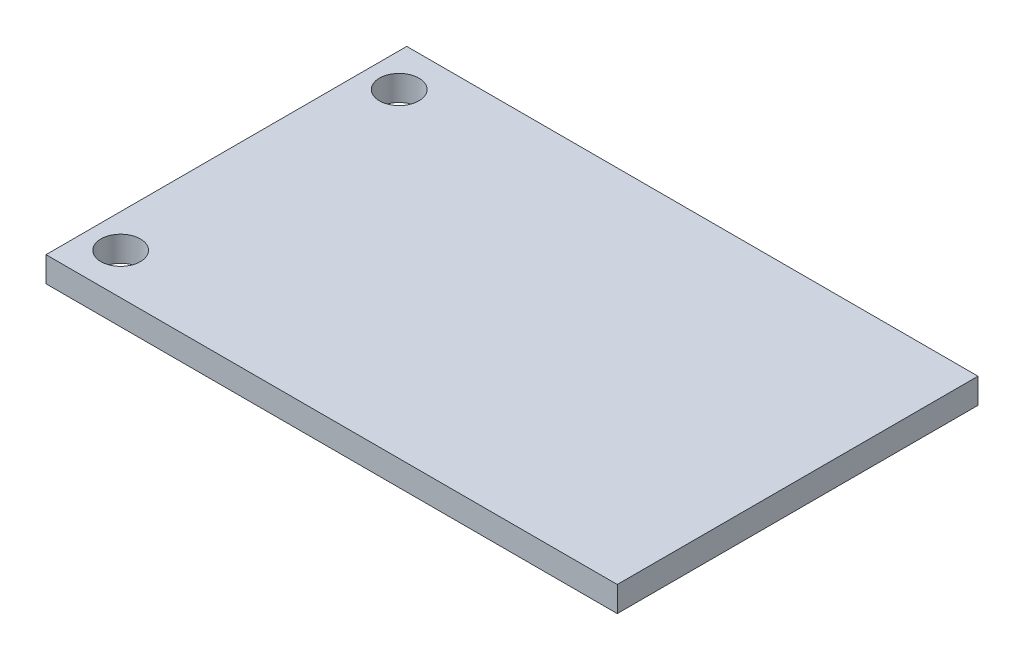
ISO-10303-21;
HEADER;
FILE_DESCRIPTION(('STEP AP214'),'2;1');
FILE_NAME('part.step','',(''),(''),'','','');
FILE_SCHEMA(('AUTOMOTIVE_DESIGN { 1 0 10303 214 1 1 1 1 }'));
ENDSEC;
DATA;
#1=APPLICATION_CONTEXT('core data for automotive mechanical design processes');
#2=APPLICATION_PROTOCOL_DEFINITION('international standard','automotive_design',2000,#1);
#3=PRODUCT_CONTEXT('',#1,'mechanical');
#4=PRODUCT('Part','Part','',(#3));
#5=PRODUCT_RELATED_PRODUCT_CATEGORY('part','',(#4));
#6=PRODUCT_DEFINITION_FORMATION('','',#4);
#7=PRODUCT_DEFINITION_CONTEXT('part definition',#1,'design');
#8=PRODUCT_DEFINITION('design','',#6,#7);
#9=PRODUCT_DEFINITION_SHAPE('','',#8);
#10=(LENGTH_UNIT() NAMED_UNIT(*) SI_UNIT(.MILLI.,.METRE.));
#11=(NAMED_UNIT(*) PLANE_ANGLE_UNIT() SI_UNIT($,.RADIAN.));
#12=(NAMED_UNIT(*) SI_UNIT($,.STERADIAN.) SOLID_ANGLE_UNIT());
#13=UNCERTAINTY_MEASURE_WITH_UNIT(LENGTH_MEASURE(1.E-05),#10,'distance_accuracy_value','');
#14=(GEOMETRIC_REPRESENTATION_CONTEXT(3) GLOBAL_UNCERTAINTY_ASSIGNED_CONTEXT((#13)) GLOBAL_UNIT_ASSIGNED_CONTEXT((#10,
#11,#12)) REPRESENTATION_CONTEXT('',''));
#15=CARTESIAN_POINT('',(0.,0.,0.));
#16=DIRECTION('',(0.,0.,1.));
#17=DIRECTION('',(1.,0.,0.));
#18=AXIS2_PLACEMENT_3D('',#15,#16,#17);
#19=CARTESIAN_POINT('',(0.,1.6,0.));
#20=DIRECTION('',(0.,1.,0.));
#21=DIRECTION('',(0.,0.,1.));
#22=AXIS2_PLACEMENT_3D('',#19,#20,#21);
#23=PLANE('',#22);
#24=CARTESIAN_POINT('',(-15.9747607466667,1.6,-8.825));
#25=DIRECTION('',(0.,1.,0.));
#26=DIRECTION('',(0.,0.,1.));
#27=AXIS2_PLACEMENT_3D('',#24,#25,#26);
#28=CIRCLE('',#27,1.25);
#29=CARTESIAN_POINT('',(-15.9747607466667,1.6,-7.575));
#30=VERTEX_POINT('',#29);
#31=EDGE_CURVE('E100',#30,#30,#28,.T.);
#32=ORIENTED_EDGE('',*,*,#31,.F.);
#33=EDGE_LOOP('',(#32));
#34=FACE_BOUND('',#33,.T.);
#35=DIRECTION('',(0.,0.,1.));
#36=VECTOR('',#35,1.);
#37=CARTESIAN_POINT('',(-18.1,1.6,-11.43));
#38=LINE('',#37,#36);
#39=CARTESIAN_POINT('',(-18.1,1.6,-11.43));
#40=VERTEX_POINT('',#39);
#41=CARTESIAN_POINT('',(-18.1,1.6,11.43));
#42=VERTEX_POINT('',#41);
#43=EDGE_CURVE('E85',#40,#42,#38,.T.);
#44=ORIENTED_EDGE('',*,*,#43,.T.);
#45=DIRECTION('',(1.,0.,0.));
#46=VECTOR('',#45,1.);
#47=CARTESIAN_POINT('',(-18.1,1.6,11.43));
#48=LINE('',#47,#46);
#49=CARTESIAN_POINT('',(18.1,1.6,11.43));
#50=VERTEX_POINT('',#49);
#51=EDGE_CURVE('E80',#42,#50,#48,.T.);
#52=ORIENTED_EDGE('',*,*,#51,.T.);
#53=DIRECTION('',(0.,0.,-1.));
#54=VECTOR('',#53,1.);
#55=CARTESIAN_POINT('',(18.1,1.6,-11.43));
#56=LINE('',#55,#54);
#57=CARTESIAN_POINT('',(18.1,1.6,-11.43));
#58=VERTEX_POINT('',#57);
#59=EDGE_CURVE('E83',#50,#58,#56,.T.);
#60=ORIENTED_EDGE('',*,*,#59,.T.);
#61=DIRECTION('',(-1.,0.,0.));
#62=VECTOR('',#61,1.);
#63=CARTESIAN_POINT('',(-18.1,1.6,-11.43));
#64=LINE('',#63,#62);
#65=EDGE_CURVE('E50',#58,#40,#64,.T.);
#66=ORIENTED_EDGE('',*,*,#65,.T.);
#67=EDGE_LOOP('',(#44,#52,#60,#66));
#68=FACE_BOUND('',#67,.T.);
#69=CARTESIAN_POINT('',(-15.9747607466667,1.6,8.825));
#70=DIRECTION('',(0.,1.,0.));
#71=DIRECTION('',(0.,0.,1.));
#72=AXIS2_PLACEMENT_3D('',#69,#70,#71);
#73=CIRCLE('',#72,1.25);
#74=CARTESIAN_POINT('',(-15.9747607466667,1.6,10.075));
#75=VERTEX_POINT('',#74);
#76=EDGE_CURVE('E115',#75,#75,#73,.T.);
#77=ORIENTED_EDGE('',*,*,#76,.F.);
#78=EDGE_LOOP('',(#77));
#79=FACE_BOUND('',#78,.T.);
#80=ADVANCED_FACE('F33',(#34,#68,#79),#23,.T.);
#81=CARTESIAN_POINT('',(0.,0.,0.));
#82=DIRECTION('',(0.,1.,0.));
#83=DIRECTION('',(0.,0.,1.));
#84=AXIS2_PLACEMENT_3D('',#81,#82,#83);
#85=PLANE('',#84);
#86=DIRECTION('',(0.,0.,1.));
#87=VECTOR('',#86,1.);
#88=CARTESIAN_POINT('',(-18.1,0.,-11.43));
#89=LINE('',#88,#87);
#90=CARTESIAN_POINT('',(-18.1,0.,-11.43));
#91=VERTEX_POINT('',#90);
#92=CARTESIAN_POINT('',(-18.1,0.,11.43));
#93=VERTEX_POINT('',#92);
#94=EDGE_CURVE('E97',#91,#93,#89,.T.);
#95=ORIENTED_EDGE('',*,*,#94,.F.);
#96=DIRECTION('',(-1.,0.,0.));
#97=VECTOR('',#96,1.);
#98=CARTESIAN_POINT('',(-18.1,0.,-11.43));
#99=LINE('',#98,#97);
#100=CARTESIAN_POINT('',(18.1,0.,-11.43));
#101=VERTEX_POINT('',#100);
#102=EDGE_CURVE('E73',#101,#91,#99,.T.);
#103=ORIENTED_EDGE('',*,*,#102,.F.);
#104=DIRECTION('',(0.,0.,-1.));
#105=VECTOR('',#104,1.);
#106=CARTESIAN_POINT('',(18.1,0.,-11.43));
#107=LINE('',#106,#105);
#108=CARTESIAN_POINT('',(18.1,0.,11.43));
#109=VERTEX_POINT('',#108);
#110=EDGE_CURVE('E67',#109,#101,#107,.T.);
#111=ORIENTED_EDGE('',*,*,#110,.F.);
#112=DIRECTION('',(1.,0.,0.));
#113=VECTOR('',#112,1.);
#114=CARTESIAN_POINT('',(-18.1,0.,11.43));
#115=LINE('',#114,#113);
#116=EDGE_CURVE('E89',#93,#109,#115,.T.);
#117=ORIENTED_EDGE('',*,*,#116,.F.);
#118=EDGE_LOOP('',(#95,#103,#111,#117));
#119=FACE_BOUND('',#118,.T.);
#120=CARTESIAN_POINT('',(-15.9747607466667,0.,-8.825));
#121=DIRECTION('',(0.,1.,0.));
#122=DIRECTION('',(0.,0.,1.));
#123=AXIS2_PLACEMENT_3D('',#120,#121,#122);
#124=CIRCLE('',#123,1.25);
#125=CARTESIAN_POINT('',(-15.9747607466667,0.,-7.575));
#126=VERTEX_POINT('',#125);
#127=EDGE_CURVE('E112',#126,#126,#124,.T.);
#128=ORIENTED_EDGE('',*,*,#127,.T.);
#129=EDGE_LOOP('',(#128));
#130=FACE_BOUND('',#129,.T.);
#131=CARTESIAN_POINT('',(-15.9747607466667,0.,8.825));
#132=DIRECTION('',(0.,1.,0.));
#133=DIRECTION('',(0.,0.,1.));
#134=AXIS2_PLACEMENT_3D('',#131,#132,#133);
#135=CIRCLE('',#134,1.25);
#136=CARTESIAN_POINT('',(-15.9747607466667,0.,10.075));
#137=VERTEX_POINT('',#136);
#138=EDGE_CURVE('E118',#137,#137,#135,.T.);
#139=ORIENTED_EDGE('',*,*,#138,.T.);
#140=EDGE_LOOP('',(#139));
#141=FACE_BOUND('',#140,.T.);
#142=ADVANCED_FACE('F108',(#119,#130,#141),#85,.F.);
#143=CARTESIAN_POINT('',(-18.1,1.6,-11.43));
#144=DIRECTION('',(1.,0.,0.));
#145=DIRECTION('',(0.,0.,-1.));
#146=AXIS2_PLACEMENT_3D('',#143,#144,#145);
#147=PLANE('',#146);
#148=ORIENTED_EDGE('',*,*,#94,.T.);
#149=DIRECTION('',(0.,-1.,0.));
#150=VECTOR('',#149,1.);
#151=CARTESIAN_POINT('',(-18.1,1.6,11.43));
#152=LINE('',#151,#150);
#153=EDGE_CURVE('E11',#42,#93,#152,.T.);
#154=ORIENTED_EDGE('',*,*,#153,.F.);
#155=ORIENTED_EDGE('',*,*,#43,.F.);
#156=DIRECTION('',(0.,-1.,0.));
#157=VECTOR('',#156,1.);
#158=CARTESIAN_POINT('',(-18.1,1.6,-11.43));
#159=LINE('',#158,#157);
#160=EDGE_CURVE('E93',#40,#91,#159,.T.);
#161=ORIENTED_EDGE('',*,*,#160,.T.);
#162=EDGE_LOOP('',(#148,#154,#155,#161));
#163=FACE_BOUND('',#162,.T.);
#164=ADVANCED_FACE('F35',(#163),#147,.F.);
#165=CARTESIAN_POINT('',(-18.1,1.6,11.43));
#166=DIRECTION('',(0.,0.,-1.));
#167=DIRECTION('',(-1.,0.,0.));
#168=AXIS2_PLACEMENT_3D('',#165,#166,#167);
#169=PLANE('',#168);
#170=ORIENTED_EDGE('',*,*,#116,.T.);
#171=DIRECTION('',(0.,-1.,0.));
#172=VECTOR('',#171,1.);
#173=CARTESIAN_POINT('',(18.1,1.6,11.43));
#174=LINE('',#173,#172);
#175=EDGE_CURVE('E42',#50,#109,#174,.T.);
#176=ORIENTED_EDGE('',*,*,#175,.F.);
#177=ORIENTED_EDGE('',*,*,#51,.F.);
#178=ORIENTED_EDGE('',*,*,#153,.T.);
#179=EDGE_LOOP('',(#170,#176,#177,#178));
#180=FACE_BOUND('',#179,.T.);
#181=ADVANCED_FACE('F88',(#180),#169,.F.);
#182=CARTESIAN_POINT('',(18.1,1.6,-11.43));
#183=DIRECTION('',(-1.,0.,0.));
#184=DIRECTION('',(0.,0.,1.));
#185=AXIS2_PLACEMENT_3D('',#182,#183,#184);
#186=PLANE('',#185);
#187=ORIENTED_EDGE('',*,*,#110,.T.);
#188=DIRECTION('',(0.,-1.,0.));
#189=VECTOR('',#188,1.);
#190=CARTESIAN_POINT('',(18.1,1.6,-11.43));
#191=LINE('',#190,#189);
#192=EDGE_CURVE('E90',#58,#101,#191,.T.);
#193=ORIENTED_EDGE('',*,*,#192,.F.);
#194=ORIENTED_EDGE('',*,*,#59,.F.);
#195=ORIENTED_EDGE('',*,*,#175,.T.);
#196=EDGE_LOOP('',(#187,#193,#194,#195));
#197=FACE_BOUND('',#196,.T.);
#198=ADVANCED_FACE('F91',(#197),#186,.F.);
#199=CARTESIAN_POINT('',(-18.1,1.6,-11.43));
#200=DIRECTION('',(0.,0.,1.));
#201=DIRECTION('',(1.,0.,0.));
#202=AXIS2_PLACEMENT_3D('',#199,#200,#201);
#203=PLANE('',#202);
#204=ORIENTED_EDGE('',*,*,#102,.T.);
#205=ORIENTED_EDGE('',*,*,#160,.F.);
#206=ORIENTED_EDGE('',*,*,#65,.F.);
#207=ORIENTED_EDGE('',*,*,#192,.T.);
#208=EDGE_LOOP('',(#204,#205,#206,#207));
#209=FACE_BOUND('',#208,.T.);
#210=ADVANCED_FACE('F105',(#209),#203,.F.);
#211=CARTESIAN_POINT('',(-15.9747607466667,1.6,-8.825));
#212=DIRECTION('',(0.,-1.,0.));
#213=DIRECTION('',(0.,0.,-1.));
#214=AXIS2_PLACEMENT_3D('',#211,#212,#213);
#215=CYLINDRICAL_SURFACE('',#214,1.25);
#216=ORIENTED_EDGE('',*,*,#31,.T.);
#217=EDGE_LOOP('',(#216));
#218=FACE_BOUND('',#217,.T.);
#219=ORIENTED_EDGE('',*,*,#127,.F.);
#220=EDGE_LOOP('',(#219));
#221=FACE_BOUND('',#220,.T.);
#222=ADVANCED_FACE('F135',(#218,#221),#215,.F.);
#223=CARTESIAN_POINT('',(-15.9747607466667,1.6,8.825));
#224=DIRECTION('',(0.,-1.,0.));
#225=DIRECTION('',(0.,0.,-1.));
#226=AXIS2_PLACEMENT_3D('',#223,#224,#225);
#227=CYLINDRICAL_SURFACE('',#226,1.25);
#228=ORIENTED_EDGE('',*,*,#76,.T.);
#229=EDGE_LOOP('',(#228));
#230=FACE_BOUND('',#229,.T.);
#231=ORIENTED_EDGE('',*,*,#138,.F.);
#232=EDGE_LOOP('',(#231));
#233=FACE_BOUND('',#232,.T.);
#234=ADVANCED_FACE('F124',(#230,#233),#227,.F.);
#235=CLOSED_SHELL('',(#80,#142,#164,#181,#198,#210,#222,#234));
#236=MANIFOLD_SOLID_BREP('B2',#235);
#237=ADVANCED_BREP_SHAPE_REPRESENTATION('',(#18,#236),#14);
#238=SHAPE_DEFINITION_REPRESENTATION(#9,#237);
ENDSEC;
END-ISO-10303-21;
